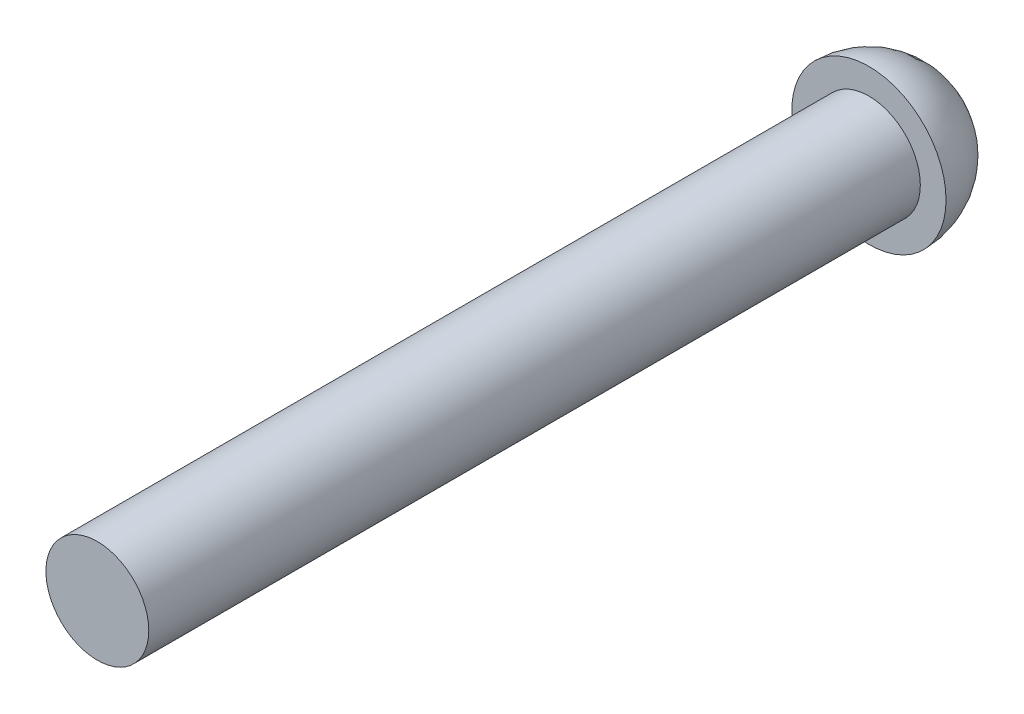
ISO-10303-21;
HEADER;
FILE_DESCRIPTION(('STEP AP214'),'2;1');
FILE_NAME('part.step','',(''),(''),'','','');
FILE_SCHEMA(('AUTOMOTIVE_DESIGN { 1 0 10303 214 1 1 1 1 }'));
ENDSEC;
DATA;
#1=APPLICATION_CONTEXT('core data for automotive mechanical design processes');
#2=APPLICATION_PROTOCOL_DEFINITION('international standard','automotive_design',2000,#1);
#3=PRODUCT_CONTEXT('',#1,'mechanical');
#4=PRODUCT('Part','Part','',(#3));
#5=PRODUCT_RELATED_PRODUCT_CATEGORY('part','',(#4));
#6=PRODUCT_DEFINITION_FORMATION('','',#4);
#7=PRODUCT_DEFINITION_CONTEXT('part definition',#1,'design');
#8=PRODUCT_DEFINITION('design','',#6,#7);
#9=PRODUCT_DEFINITION_SHAPE('','',#8);
#10=(LENGTH_UNIT() NAMED_UNIT(*) SI_UNIT(.MILLI.,.METRE.));
#11=(NAMED_UNIT(*) PLANE_ANGLE_UNIT() SI_UNIT($,.RADIAN.));
#12=(NAMED_UNIT(*) SI_UNIT($,.STERADIAN.) SOLID_ANGLE_UNIT());
#13=UNCERTAINTY_MEASURE_WITH_UNIT(LENGTH_MEASURE(1.E-05),#10,'distance_accuracy_value','');
#14=(GEOMETRIC_REPRESENTATION_CONTEXT(3) GLOBAL_UNCERTAINTY_ASSIGNED_CONTEXT((#13)) GLOBAL_UNIT_ASSIGNED_CONTEXT((#10,
#11,#12)) REPRESENTATION_CONTEXT('',''));
#15=CARTESIAN_POINT('',(0.,0.,0.));
#16=DIRECTION('',(0.,0.,1.));
#17=DIRECTION('',(1.,0.,0.));
#18=AXIS2_PLACEMENT_3D('',#15,#16,#17);
#19=CARTESIAN_POINT('',(0.,0.,0.));
#20=DIRECTION('',(0.,0.,1.));
#21=DIRECTION('',(1.,0.,0.));
#22=AXIS2_PLACEMENT_3D('',#19,#20,#21);
#23=SPHERICAL_SURFACE('',#22,1.5);
#24=CARTESIAN_POINT('',(0.,0.,0.));
#25=DIRECTION('',(0.,0.,1.));
#26=DIRECTION('',(1.,0.,0.));
#27=AXIS2_PLACEMENT_3D('',#24,#25,#26);
#28=CIRCLE('',#27,1.5);
#29=CARTESIAN_POINT('',(1.5,0.,0.));
#30=VERTEX_POINT('',#29);
#31=EDGE_CURVE('E75',#30,#30,#28,.T.);
#32=ORIENTED_EDGE('',*,*,#31,.F.);
#33=EDGE_LOOP('',(#32));
#34=FACE_BOUND('',#33,.T.);
#35=CARTESIAN_POINT('',(-0.0839327807524314,0.,0.));
#36=DIRECTION('',(1.,0.,0.));
#37=DIRECTION('',(0.,0.,-1.));
#38=AXIS2_PLACEMENT_3D('',#35,#36,#37);
#39=CIRCLE('',#38,1.4976499218159);
#40=CARTESIAN_POINT('',(-0.0839327807524314,1.23681464660165,-0.84453822783034));
#41=VERTEX_POINT('',#40);
#42=CARTESIAN_POINT('',(-0.0839327807524314,-1.23681464660165,-0.84453822783034));
#43=VERTEX_POINT('',#42);
#44=EDGE_CURVE('E73',#41,#43,#39,.F.);
#45=ORIENTED_EDGE('',*,*,#44,.T.);
#46=CARTESIAN_POINT('',(0.,0.,-0.84453822783034));
#47=DIRECTION('',(0.,0.,-1.));
#48=DIRECTION('',(-1.,0.,0.));
#49=AXIS2_PLACEMENT_3D('',#46,#47,#48);
#50=CIRCLE('',#49,1.23965930066821);
#51=CARTESIAN_POINT('',(0.0839327807524316,-1.23681464660165,-0.84453822783034));
#52=VERTEX_POINT('',#51);
#53=EDGE_CURVE('E11',#43,#52,#50,.F.);
#54=ORIENTED_EDGE('',*,*,#53,.T.);
#55=CARTESIAN_POINT('',(0.0839327807524316,0.,0.));
#56=DIRECTION('',(-1.,0.,0.));
#57=DIRECTION('',(0.,0.,1.));
#58=AXIS2_PLACEMENT_3D('',#55,#56,#57);
#59=CIRCLE('',#58,1.4976499218159);
#60=CARTESIAN_POINT('',(0.0839327807524316,1.23681464660165,-0.84453822783034));
#61=VERTEX_POINT('',#60);
#62=EDGE_CURVE('E43',#52,#61,#59,.F.);
#63=ORIENTED_EDGE('',*,*,#62,.T.);
#64=EDGE_CURVE('E49',#61,#41,#50,.F.);
#65=ORIENTED_EDGE('',*,*,#64,.T.);
#66=EDGE_LOOP('',(#45,#54,#63,#65));
#67=FACE_BOUND('',#66,.T.);
#68=ADVANCED_FACE('F39',(#34,#67),#23,.T.);
#69=CARTESIAN_POINT('',(0.,0.,15.));
#70=DIRECTION('',(0.,0.,-1.));
#71=DIRECTION('',(-1.,0.,0.));
#72=AXIS2_PLACEMENT_3D('',#69,#70,#71);
#73=CYLINDRICAL_SURFACE('',#72,1.);
#74=CARTESIAN_POINT('',(0.,0.,15.));
#75=DIRECTION('',(0.,0.,1.));
#76=DIRECTION('',(1.,0.,0.));
#77=AXIS2_PLACEMENT_3D('',#74,#75,#76);
#78=CIRCLE('',#77,1.);
#79=CARTESIAN_POINT('',(1.,0.,15.));
#80=VERTEX_POINT('',#79);
#81=EDGE_CURVE('E77',#80,#80,#78,.T.);
#82=ORIENTED_EDGE('',*,*,#81,.F.);
#83=EDGE_LOOP('',(#82));
#84=FACE_BOUND('',#83,.T.);
#85=CARTESIAN_POINT('',(0.,0.,0.));
#86=DIRECTION('',(0.,0.,1.));
#87=DIRECTION('',(1.,0.,0.));
#88=AXIS2_PLACEMENT_3D('',#85,#86,#87);
#89=CIRCLE('',#88,1.);
#90=CARTESIAN_POINT('',(1.,0.,0.));
#91=VERTEX_POINT('',#90);
#92=EDGE_CURVE('E81',#91,#91,#89,.T.);
#93=ORIENTED_EDGE('',*,*,#92,.T.);
#94=EDGE_LOOP('',(#93));
#95=FACE_BOUND('',#94,.T.);
#96=ADVANCED_FACE('F41',(#84,#95),#73,.T.);
#97=CARTESIAN_POINT('',(0.,0.,15.));
#98=DIRECTION('',(0.,0.,1.));
#99=DIRECTION('',(1.,0.,0.));
#100=AXIS2_PLACEMENT_3D('',#97,#98,#99);
#101=PLANE('',#100);
#102=ORIENTED_EDGE('',*,*,#81,.T.);
#103=EDGE_LOOP('',(#102));
#104=FACE_BOUND('',#103,.T.);
#105=ADVANCED_FACE('F97',(#104),#101,.T.);
#106=CARTESIAN_POINT('',(0.,0.,0.));
#107=DIRECTION('',(0.,0.,1.));
#108=DIRECTION('',(1.,0.,0.));
#109=AXIS2_PLACEMENT_3D('',#106,#107,#108);
#110=PLANE('',#109);
#111=ORIENTED_EDGE('',*,*,#92,.F.);
#112=EDGE_LOOP('',(#111));
#113=FACE_BOUND('',#112,.T.);
#114=ORIENTED_EDGE('',*,*,#31,.T.);
#115=EDGE_LOOP('',(#114));
#116=FACE_BOUND('',#115,.T.);
#117=ADVANCED_FACE('F88',(#113,#116),#110,.T.);
#118=CARTESIAN_POINT('',(0.0839327807524316,10.,-2.15546177216966));
#119=DIRECTION('',(-1.,0.,0.));
#120=DIRECTION('',(0.,0.,1.));
#121=AXIS2_PLACEMENT_3D('',#118,#119,#120);
#122=PLANE('',#121);
#123=DIRECTION('',(0.,-1.,0.));
#124=VECTOR('',#123,1.);
#125=CARTESIAN_POINT('',(0.0839327807524316,10.,-0.84453822783034));
#126=LINE('',#125,#124);
#127=EDGE_CURVE('E68',#61,#52,#126,.T.);
#128=ORIENTED_EDGE('',*,*,#127,.F.);
#129=ORIENTED_EDGE('',*,*,#62,.F.);
#130=EDGE_LOOP('',(#128,#129));
#131=FACE_BOUND('',#130,.T.);
#132=ADVANCED_FACE('F101',(#131),#122,.T.);
#133=CARTESIAN_POINT('',(-0.0839327807524314,10.,-2.15546177216966));
#134=DIRECTION('',(1.,0.,0.));
#135=DIRECTION('',(0.,0.,-1.));
#136=AXIS2_PLACEMENT_3D('',#133,#134,#135);
#137=PLANE('',#136);
#138=DIRECTION('',(0.,-1.,0.));
#139=VECTOR('',#138,1.);
#140=CARTESIAN_POINT('',(-0.0839327807524314,10.,-0.84453822783034));
#141=LINE('',#140,#139);
#142=EDGE_CURVE('E56',#41,#43,#141,.T.);
#143=ORIENTED_EDGE('',*,*,#142,.T.);
#144=ORIENTED_EDGE('',*,*,#44,.F.);
#145=EDGE_LOOP('',(#143,#144));
#146=FACE_BOUND('',#145,.T.);
#147=ADVANCED_FACE('F72',(#146),#137,.T.);
#148=CARTESIAN_POINT('',(-0.0839327807524314,10.,-0.84453822783034));
#149=DIRECTION('',(0.,0.,-1.));
#150=DIRECTION('',(-1.,0.,0.));
#151=AXIS2_PLACEMENT_3D('',#148,#149,#150);
#152=PLANE('',#151);
#153=ORIENTED_EDGE('',*,*,#142,.F.);
#154=ORIENTED_EDGE('',*,*,#64,.F.);
#155=ORIENTED_EDGE('',*,*,#127,.T.);
#156=ORIENTED_EDGE('',*,*,#53,.F.);
#157=EDGE_LOOP('',(#153,#154,#155,#156));
#158=FACE_BOUND('',#157,.T.);
#159=ADVANCED_FACE('F67',(#158),#152,.T.);
#160=CLOSED_SHELL('',(#68,#96,#105,#117,#132,#147,#159));
#161=MANIFOLD_SOLID_BREP('B2',#160);
#162=ADVANCED_BREP_SHAPE_REPRESENTATION('',(#18,#161),#14);
#163=SHAPE_DEFINITION_REPRESENTATION(#9,#162);
ENDSEC;
END-ISO-10303-21;
